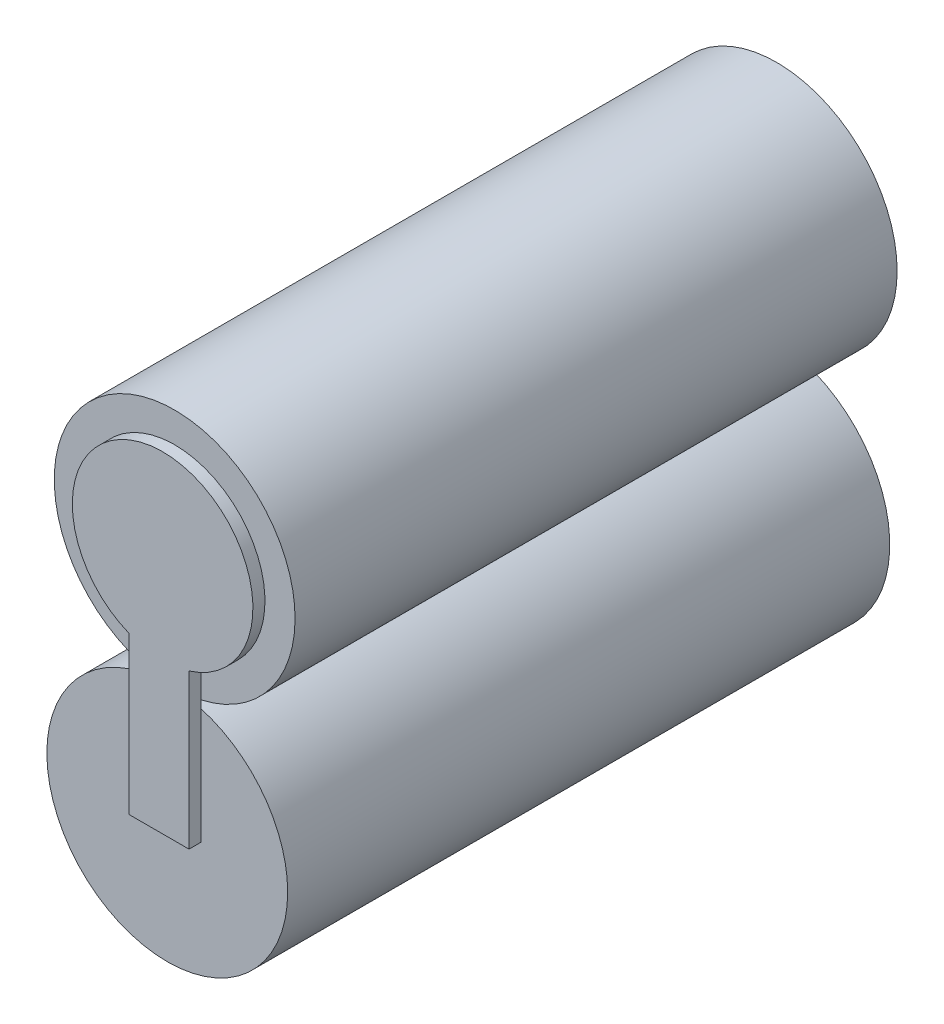
ISO-10303-21;
HEADER;
FILE_DESCRIPTION(('STEP AP214'),'2;1');
FILE_NAME('part.step','',(''),(''),'','','');
FILE_SCHEMA(('AUTOMOTIVE_DESIGN { 1 0 10303 214 1 1 1 1 }'));
ENDSEC;
DATA;
#1=APPLICATION_CONTEXT('core data for automotive mechanical design processes');
#2=APPLICATION_PROTOCOL_DEFINITION('international standard','automotive_design',2000,#1);
#3=PRODUCT_CONTEXT('',#1,'mechanical');
#4=PRODUCT('Part','Part','',(#3));
#5=PRODUCT_RELATED_PRODUCT_CATEGORY('part','',(#4));
#6=PRODUCT_DEFINITION_FORMATION('','',#4);
#7=PRODUCT_DEFINITION_CONTEXT('part definition',#1,'design');
#8=PRODUCT_DEFINITION('design','',#6,#7);
#9=PRODUCT_DEFINITION_SHAPE('','',#8);
#10=(LENGTH_UNIT() NAMED_UNIT(*) SI_UNIT(.MILLI.,.METRE.));
#11=(NAMED_UNIT(*) PLANE_ANGLE_UNIT() SI_UNIT($,.RADIAN.));
#12=(NAMED_UNIT(*) SI_UNIT($,.STERADIAN.) SOLID_ANGLE_UNIT());
#13=UNCERTAINTY_MEASURE_WITH_UNIT(LENGTH_MEASURE(1.E-05),#10,'distance_accuracy_value','');
#14=(GEOMETRIC_REPRESENTATION_CONTEXT(3) GLOBAL_UNCERTAINTY_ASSIGNED_CONTEXT((#13)) GLOBAL_UNIT_ASSIGNED_CONTEXT((#10,
#11,#12)) REPRESENTATION_CONTEXT('',''));
#15=CARTESIAN_POINT('',(0.,0.,0.));
#16=DIRECTION('',(0.,0.,1.));
#17=DIRECTION('',(1.,0.,0.));
#18=AXIS2_PLACEMENT_3D('',#15,#16,#17);
#19=CARTESIAN_POINT('',(-67.9226645266029,509.706213161394,50.));
#20=DIRECTION('',(0.,0.,-1.));
#21=DIRECTION('',(-1.,0.,0.));
#22=AXIS2_PLACEMENT_3D('',#19,#20,#21);
#23=CYLINDRICAL_SURFACE('',#22,10.0000000000001);
#24=CARTESIAN_POINT('',(-67.9226645266029,509.706213161394,50.));
#25=DIRECTION('',(0.,0.,1.));
#26=DIRECTION('',(1.,0.,0.));
#27=AXIS2_PLACEMENT_3D('',#24,#25,#26);
#28=CIRCLE('',#27,10.0000000000001);
#29=CARTESIAN_POINT('',(-57.9226645266028,509.706213161394,50.));
#30=VERTEX_POINT('',#29);
#31=EDGE_CURVE('E74',#30,#30,#28,.T.);
#32=ORIENTED_EDGE('',*,*,#31,.F.);
#33=EDGE_LOOP('',(#32));
#34=FACE_BOUND('',#33,.T.);
#35=CARTESIAN_POINT('',(-67.9226645266029,509.706213161394,0.));
#36=DIRECTION('',(0.,0.,1.));
#37=DIRECTION('',(1.,0.,0.));
#38=AXIS2_PLACEMENT_3D('',#35,#36,#37);
#39=CIRCLE('',#38,10.0000000000001);
#40=CARTESIAN_POINT('',(-65.1157716757957,519.304200060952,0.));
#41=VERTEX_POINT('',#40);
#42=CARTESIAN_POINT('',(-70.1157716757957,519.462763834257,0.));
#43=VERTEX_POINT('',#42);
#44=EDGE_CURVE('E69',#41,#43,#39,.T.);
#45=ORIENTED_EDGE('',*,*,#44,.T.);
#46=EDGE_CURVE('E87',#43,#41,#39,.T.);
#47=ORIENTED_EDGE('',*,*,#46,.T.);
#48=EDGE_LOOP('',(#45,#47));
#49=FACE_BOUND('',#48,.T.);
#50=ADVANCED_FACE('F66',(#34,#49),#23,.T.);
#51=CARTESIAN_POINT('',(0.,0.,50.));
#52=DIRECTION('',(0.,0.,1.));
#53=DIRECTION('',(1.,0.,0.));
#54=AXIS2_PLACEMENT_3D('',#51,#52,#53);
#55=PLANE('',#54);
#56=ORIENTED_EDGE('',*,*,#31,.T.);
#57=EDGE_LOOP('',(#56));
#58=FACE_BOUND('',#57,.T.);
#59=ADVANCED_FACE('F176',(#58),#55,.T.);
#60=CARTESIAN_POINT('',(0.,0.,0.));
#61=DIRECTION('',(0.,0.,1.));
#62=DIRECTION('',(1.,0.,0.));
#63=AXIS2_PLACEMENT_3D('',#60,#61,#62);
#64=PLANE('',#63);
#65=DIRECTION('',(0.,-1.,0.));
#66=VECTOR('',#65,1.);
#67=CARTESIAN_POINT('',(-65.1157716757957,516.661164816444,0.));
#68=LINE('',#67,#66);
#69=CARTESIAN_POINT('',(-65.1157716757957,516.661164816444,0.));
#70=VERTEX_POINT('',#69);
#71=EDGE_CURVE('E15',#41,#70,#68,.T.);
#72=ORIENTED_EDGE('',*,*,#71,.F.);
#73=ORIENTED_EDGE('',*,*,#46,.F.);
#74=DIRECTION('',(0.,1.,0.));
#75=VECTOR('',#74,1.);
#76=CARTESIAN_POINT('',(-70.1157716757957,516.878401184038,0.));
#77=LINE('',#76,#75);
#78=CARTESIAN_POINT('',(-70.1157716757957,516.878401184038,0.));
#79=VERTEX_POINT('',#78);
#80=EDGE_CURVE('E155',#79,#43,#77,.T.);
#81=ORIENTED_EDGE('',*,*,#80,.F.);
#82=CARTESIAN_POINT('',(-67.9226645266029,509.706213161394,0.));
#83=DIRECTION('',(0.,0.,-1.));
#84=DIRECTION('',(-1.,0.,0.));
#85=AXIS2_PLACEMENT_3D('',#82,#83,#84);
#86=CIRCLE('',#85,7.49999999999999);
#87=EDGE_CURVE('E83',#70,#79,#86,.T.);
#88=ORIENTED_EDGE('',*,*,#87,.F.);
#89=EDGE_LOOP('',(#72,#73,#81,#88));
#90=FACE_BOUND('',#89,.T.);
#91=ADVANCED_FACE('F181',(#90),#64,.F.);
#92=CARTESIAN_POINT('',(-65.1157716757957,516.661164816444,-1.));
#93=DIRECTION('',(-1.,0.,0.));
#94=DIRECTION('',(0.,0.,1.));
#95=AXIS2_PLACEMENT_3D('',#92,#93,#94);
#96=PLANE('',#95);
#97=CARTESIAN_POINT('',(-65.1157716757957,529.696502890967,0.));
#98=VERTEX_POINT('',#97);
#99=EDGE_CURVE('E76',#98,#41,#68,.T.);
#100=ORIENTED_EDGE('',*,*,#99,.T.);
#101=ORIENTED_EDGE('',*,*,#71,.T.);
#102=DIRECTION('',(0.,0.,1.));
#103=VECTOR('',#102,1.);
#104=CARTESIAN_POINT('',(-65.1157716757957,516.661164816444,-1.));
#105=LINE('',#104,#103);
#106=CARTESIAN_POINT('',(-65.1157716757957,516.661164816444,-1.));
#107=VERTEX_POINT('',#106);
#108=EDGE_CURVE('E117',#107,#70,#105,.T.);
#109=ORIENTED_EDGE('',*,*,#108,.F.);
#110=DIRECTION('',(0.,-1.,0.));
#111=VECTOR('',#110,1.);
#112=CARTESIAN_POINT('',(-65.1157716757957,516.661164816444,-1.));
#113=LINE('',#112,#111);
#114=CARTESIAN_POINT('',(-65.1157716757957,529.696502890967,-1.));
#115=VERTEX_POINT('',#114);
#116=EDGE_CURVE('E123',#115,#107,#113,.T.);
#117=ORIENTED_EDGE('',*,*,#116,.F.);
#118=DIRECTION('',(0.,0.,1.));
#119=VECTOR('',#118,1.);
#120=CARTESIAN_POINT('',(-65.1157716757957,529.696502890967,-1.));
#121=LINE('',#120,#119);
#122=EDGE_CURVE('E161',#115,#98,#121,.T.);
#123=ORIENTED_EDGE('',*,*,#122,.T.);
#124=EDGE_LOOP('',(#100,#101,#109,#117,#123));
#125=FACE_BOUND('',#124,.T.);
#126=ADVANCED_FACE('F135',(#125),#96,.F.);
#127=CARTESIAN_POINT('',(-67.9226645266029,509.706213161394,-1.));
#128=DIRECTION('',(0.,0.,1.));
#129=DIRECTION('',(1.,0.,0.));
#130=AXIS2_PLACEMENT_3D('',#127,#128,#129);
#131=CYLINDRICAL_SURFACE('',#130,7.49999999999999);
#132=ORIENTED_EDGE('',*,*,#87,.T.);
#133=DIRECTION('',(0.,0.,1.));
#134=VECTOR('',#133,1.);
#135=CARTESIAN_POINT('',(-70.1157716757957,516.878401184038,-1.));
#136=LINE('',#135,#134);
#137=CARTESIAN_POINT('',(-70.1157716757957,516.878401184038,-1.));
#138=VERTEX_POINT('',#137);
#139=EDGE_CURVE('E119',#138,#79,#136,.T.);
#140=ORIENTED_EDGE('',*,*,#139,.F.);
#141=CARTESIAN_POINT('',(-67.9226645266029,509.706213161394,-1.));
#142=DIRECTION('',(0.,0.,-1.));
#143=DIRECTION('',(-1.,0.,0.));
#144=AXIS2_PLACEMENT_3D('',#141,#142,#143);
#145=CIRCLE('',#144,7.49999999999999);
#146=EDGE_CURVE('E113',#107,#138,#145,.T.);
#147=ORIENTED_EDGE('',*,*,#146,.F.);
#148=ORIENTED_EDGE('',*,*,#108,.T.);
#149=EDGE_LOOP('',(#132,#140,#147,#148));
#150=FACE_BOUND('',#149,.T.);
#151=ADVANCED_FACE('F115',(#150),#131,.T.);
#152=CARTESIAN_POINT('',(-70.1157716757957,516.878401184038,-1.));
#153=DIRECTION('',(1.,0.,0.));
#154=DIRECTION('',(0.,0.,-1.));
#155=AXIS2_PLACEMENT_3D('',#152,#153,#154);
#156=PLANE('',#155);
#157=ORIENTED_EDGE('',*,*,#80,.T.);
#158=CARTESIAN_POINT('',(-70.1157716757957,529.696502890967,0.));
#159=VERTEX_POINT('',#158);
#160=EDGE_CURVE('E149',#43,#159,#77,.T.);
#161=ORIENTED_EDGE('',*,*,#160,.T.);
#162=DIRECTION('',(0.,0.,1.));
#163=VECTOR('',#162,1.);
#164=CARTESIAN_POINT('',(-70.1157716757957,529.696502890967,-1.));
#165=LINE('',#164,#163);
#166=CARTESIAN_POINT('',(-70.1157716757957,529.696502890967,-1.));
#167=VERTEX_POINT('',#166);
#168=EDGE_CURVE('E137',#167,#159,#165,.T.);
#169=ORIENTED_EDGE('',*,*,#168,.F.);
#170=DIRECTION('',(0.,1.,0.));
#171=VECTOR('',#170,1.);
#172=CARTESIAN_POINT('',(-70.1157716757957,516.878401184038,-1.));
#173=LINE('',#172,#171);
#174=EDGE_CURVE('E122',#138,#167,#173,.T.);
#175=ORIENTED_EDGE('',*,*,#174,.F.);
#176=ORIENTED_EDGE('',*,*,#139,.T.);
#177=EDGE_LOOP('',(#157,#161,#169,#175,#176));
#178=FACE_BOUND('',#177,.T.);
#179=ADVANCED_FACE('F157',(#178),#156,.F.);
#180=CARTESIAN_POINT('',(-70.1157716757957,529.696502890967,-1.));
#181=DIRECTION('',(0.,-1.,0.));
#182=DIRECTION('',(0.,0.,-1.));
#183=AXIS2_PLACEMENT_3D('',#180,#181,#182);
#184=PLANE('',#183);
#185=DIRECTION('',(1.,0.,0.));
#186=VECTOR('',#185,1.);
#187=CARTESIAN_POINT('',(-70.1157716757957,529.696502890967,0.));
#188=LINE('',#187,#186);
#189=EDGE_CURVE('E132',#159,#98,#188,.T.);
#190=ORIENTED_EDGE('',*,*,#189,.T.);
#191=ORIENTED_EDGE('',*,*,#122,.F.);
#192=DIRECTION('',(1.,0.,0.));
#193=VECTOR('',#192,1.);
#194=CARTESIAN_POINT('',(-70.1157716757957,529.696502890967,-1.));
#195=LINE('',#194,#193);
#196=EDGE_CURVE('E128',#167,#115,#195,.T.);
#197=ORIENTED_EDGE('',*,*,#196,.F.);
#198=ORIENTED_EDGE('',*,*,#168,.T.);
#199=EDGE_LOOP('',(#190,#191,#197,#198));
#200=FACE_BOUND('',#199,.T.);
#201=ADVANCED_FACE('F163',(#200),#184,.F.);
#202=CARTESIAN_POINT('',(-67.9226645266029,509.706213161394,-1.));
#203=DIRECTION('',(0.,0.,-1.));
#204=DIRECTION('',(-1.,0.,0.));
#205=AXIS2_PLACEMENT_3D('',#202,#203,#204);
#206=PLANE('',#205);
#207=ORIENTED_EDGE('',*,*,#116,.T.);
#208=ORIENTED_EDGE('',*,*,#146,.T.);
#209=ORIENTED_EDGE('',*,*,#174,.T.);
#210=ORIENTED_EDGE('',*,*,#196,.T.);
#211=EDGE_LOOP('',(#207,#208,#209,#210));
#212=FACE_BOUND('',#211,.T.);
#213=ADVANCED_FACE('F126',(#212),#206,.T.);
#214=CARTESIAN_POINT('',(-67.9226645266029,509.706213161394,0.));
#215=DIRECTION('',(0.,0.,-1.));
#216=DIRECTION('',(-1.,0.,0.));
#217=AXIS2_PLACEMENT_3D('',#214,#215,#216);
#218=PLANE('',#217);
#219=ORIENTED_EDGE('',*,*,#44,.F.);
#220=ORIENTED_EDGE('',*,*,#99,.F.);
#221=ORIENTED_EDGE('',*,*,#189,.F.);
#222=ORIENTED_EDGE('',*,*,#160,.F.);
#223=EDGE_LOOP('',(#219,#220,#221,#222));
#224=FACE_BOUND('',#223,.T.);
#225=ADVANCED_FACE('F151',(#224),#218,.F.);
#226=CLOSED_SHELL('',(#50,#59,#91,#126,#151,#179,#201,#213,#225));
#227=MANIFOLD_SOLID_BREP('B2',#226);
#228=CARTESIAN_POINT('',(-67.3088788249885,529.696792620541,50.));
#229=DIRECTION('',(0.,0.,-1.));
#230=DIRECTION('',(-1.,0.,0.));
#231=AXIS2_PLACEMENT_3D('',#228,#229,#230);
#232=CYLINDRICAL_SURFACE('',#231,9.99999999999996);
#233=CARTESIAN_POINT('',(-67.3088788249885,529.696792620541,50.));
#234=DIRECTION('',(0.,0.,1.));
#235=DIRECTION('',(1.,0.,0.));
#236=AXIS2_PLACEMENT_3D('',#233,#234,#235);
#237=CIRCLE('',#236,9.99999999999996);
#238=CARTESIAN_POINT('',(-70.1157716757957,520.098805720983,50.));
#239=VERTEX_POINT('',#238);
#240=CARTESIAN_POINT('',(-65.1157716757957,519.940241947677,50.));
#241=VERTEX_POINT('',#240);
#242=EDGE_CURVE('E257',#239,#241,#237,.T.);
#243=ORIENTED_EDGE('',*,*,#242,.F.);
#244=EDGE_CURVE('E322',#241,#239,#237,.T.);
#245=ORIENTED_EDGE('',*,*,#244,.F.);
#246=EDGE_LOOP('',(#243,#245));
#247=FACE_BOUND('',#246,.T.);
#248=CARTESIAN_POINT('',(-67.3088788249885,529.696792620541,0.));
#249=DIRECTION('',(0.,0.,1.));
#250=DIRECTION('',(1.,0.,0.));
#251=AXIS2_PLACEMENT_3D('',#248,#249,#250);
#252=CIRCLE('',#251,9.99999999999996);
#253=CARTESIAN_POINT('',(-57.3088788249885,529.696792620541,0.));
#254=VERTEX_POINT('',#253);
#255=EDGE_CURVE('E252',#254,#254,#252,.T.);
#256=ORIENTED_EDGE('',*,*,#255,.T.);
#257=EDGE_LOOP('',(#256));
#258=FACE_BOUND('',#257,.T.);
#259=ADVANCED_FACE('F249',(#247,#258),#232,.T.);
#260=CARTESIAN_POINT('',(0.,0.,50.));
#261=DIRECTION('',(0.,0.,1.));
#262=DIRECTION('',(1.,0.,0.));
#263=AXIS2_PLACEMENT_3D('',#260,#261,#262);
#264=PLANE('',#263);
#265=DIRECTION('',(0.,-1.,0.));
#266=VECTOR('',#265,1.);
#267=CARTESIAN_POINT('',(-70.1157716757957,522.741840965491,50.));
#268=LINE('',#267,#266);
#269=CARTESIAN_POINT('',(-70.1157716757957,522.741840965491,50.));
#270=VERTEX_POINT('',#269);
#271=EDGE_CURVE('E266',#270,#239,#268,.T.);
#272=ORIENTED_EDGE('',*,*,#271,.F.);
#273=CARTESIAN_POINT('',(-67.3088788249885,529.696792620541,50.));
#274=DIRECTION('',(0.,0.,1.));
#275=DIRECTION('',(1.,0.,0.));
#276=AXIS2_PLACEMENT_3D('',#273,#274,#275);
#277=CIRCLE('',#276,7.49999999999999);
#278=CARTESIAN_POINT('',(-65.1157716757957,522.524604597897,50.));
#279=VERTEX_POINT('',#278);
#280=EDGE_CURVE('E314',#279,#270,#277,.T.);
#281=ORIENTED_EDGE('',*,*,#280,.F.);
#282=DIRECTION('',(0.,1.,0.));
#283=VECTOR('',#282,1.);
#284=CARTESIAN_POINT('',(-65.1157716757957,522.524604597897,50.));
#285=LINE('',#284,#283);
#286=EDGE_CURVE('E64',#241,#279,#285,.T.);
#287=ORIENTED_EDGE('',*,*,#286,.F.);
#288=ORIENTED_EDGE('',*,*,#244,.T.);
#289=EDGE_LOOP('',(#272,#281,#287,#288));
#290=FACE_BOUND('',#289,.T.);
#291=ADVANCED_FACE('F331',(#290),#264,.T.);
#292=CARTESIAN_POINT('',(0.,0.,0.));
#293=DIRECTION('',(0.,0.,1.));
#294=DIRECTION('',(1.,0.,0.));
#295=AXIS2_PLACEMENT_3D('',#292,#293,#294);
#296=PLANE('',#295);
#297=ORIENTED_EDGE('',*,*,#255,.F.);
#298=EDGE_LOOP('',(#297));
#299=FACE_BOUND('',#298,.T.);
#300=ADVANCED_FACE('F361',(#299),#296,.F.);
#301=CARTESIAN_POINT('',(-67.3088788249885,529.696792620541,50.));
#302=DIRECTION('',(0.,0.,1.));
#303=DIRECTION('',(1.,0.,0.));
#304=AXIS2_PLACEMENT_3D('',#301,#302,#303);
#305=PLANE('',#304);
#306=CARTESIAN_POINT('',(-70.1157716757957,509.706502890967,50.));
#307=VERTEX_POINT('',#306);
#308=EDGE_CURVE('E318',#239,#307,#268,.T.);
#309=ORIENTED_EDGE('',*,*,#308,.F.);
#310=ORIENTED_EDGE('',*,*,#242,.T.);
#311=CARTESIAN_POINT('',(-65.1157716757957,509.706502890967,50.));
#312=VERTEX_POINT('',#311);
#313=EDGE_CURVE('E259',#312,#241,#285,.T.);
#314=ORIENTED_EDGE('',*,*,#313,.F.);
#315=DIRECTION('',(1.,0.,0.));
#316=VECTOR('',#315,1.);
#317=CARTESIAN_POINT('',(-65.1157716757957,509.706502890967,50.));
#318=LINE('',#317,#316);
#319=EDGE_CURVE('E335',#307,#312,#318,.T.);
#320=ORIENTED_EDGE('',*,*,#319,.F.);
#321=EDGE_LOOP('',(#309,#310,#314,#320));
#322=FACE_BOUND('',#321,.T.);
#323=ADVANCED_FACE('F334',(#322),#305,.F.);
#324=CARTESIAN_POINT('',(-70.1157716757957,522.741840965491,51.));
#325=DIRECTION('',(1.,0.,0.));
#326=DIRECTION('',(0.,0.,-1.));
#327=AXIS2_PLACEMENT_3D('',#324,#325,#326);
#328=PLANE('',#327);
#329=ORIENTED_EDGE('',*,*,#271,.T.);
#330=ORIENTED_EDGE('',*,*,#308,.T.);
#331=DIRECTION('',(0.,0.,-1.));
#332=VECTOR('',#331,1.);
#333=CARTESIAN_POINT('',(-70.1157716757957,509.706502890967,51.));
#334=LINE('',#333,#332);
#335=CARTESIAN_POINT('',(-70.1157716757957,509.706502890967,51.));
#336=VERTEX_POINT('',#335);
#337=EDGE_CURVE('E299',#336,#307,#334,.T.);
#338=ORIENTED_EDGE('',*,*,#337,.F.);
#339=DIRECTION('',(0.,-1.,0.));
#340=VECTOR('',#339,1.);
#341=CARTESIAN_POINT('',(-70.1157716757957,522.741840965491,51.));
#342=LINE('',#341,#340);
#343=CARTESIAN_POINT('',(-70.1157716757957,522.741840965491,51.));
#344=VERTEX_POINT('',#343);
#345=EDGE_CURVE('E305',#344,#336,#342,.T.);
#346=ORIENTED_EDGE('',*,*,#345,.F.);
#347=DIRECTION('',(0.,0.,-1.));
#348=VECTOR('',#347,1.);
#349=CARTESIAN_POINT('',(-70.1157716757957,522.741840965491,51.));
#350=LINE('',#349,#348);
#351=EDGE_CURVE('E337',#344,#270,#350,.T.);
#352=ORIENTED_EDGE('',*,*,#351,.T.);
#353=EDGE_LOOP('',(#329,#330,#338,#346,#352));
#354=FACE_BOUND('',#353,.T.);
#355=ADVANCED_FACE('F316',(#354),#328,.F.);
#356=CARTESIAN_POINT('',(-65.1157716757957,509.706502890967,51.));
#357=DIRECTION('',(0.,1.,0.));
#358=DIRECTION('',(0.,0.,1.));
#359=AXIS2_PLACEMENT_3D('',#356,#357,#358);
#360=PLANE('',#359);
#361=ORIENTED_EDGE('',*,*,#319,.T.);
#362=DIRECTION('',(0.,0.,-1.));
#363=VECTOR('',#362,1.);
#364=CARTESIAN_POINT('',(-65.1157716757957,509.706502890967,51.));
#365=LINE('',#364,#363);
#366=CARTESIAN_POINT('',(-65.1157716757957,509.706502890967,51.));
#367=VERTEX_POINT('',#366);
#368=EDGE_CURVE('E301',#367,#312,#365,.T.);
#369=ORIENTED_EDGE('',*,*,#368,.F.);
#370=DIRECTION('',(1.,0.,0.));
#371=VECTOR('',#370,1.);
#372=CARTESIAN_POINT('',(-65.1157716757957,509.706502890967,51.));
#373=LINE('',#372,#371);
#374=EDGE_CURVE('E295',#336,#367,#373,.T.);
#375=ORIENTED_EDGE('',*,*,#374,.F.);
#376=ORIENTED_EDGE('',*,*,#337,.T.);
#377=EDGE_LOOP('',(#361,#369,#375,#376));
#378=FACE_BOUND('',#377,.T.);
#379=ADVANCED_FACE('F297',(#378),#360,.F.);
#380=CARTESIAN_POINT('',(-65.1157716757957,522.524604597897,51.));
#381=DIRECTION('',(-1.,0.,0.));
#382=DIRECTION('',(0.,0.,1.));
#383=AXIS2_PLACEMENT_3D('',#380,#381,#382);
#384=PLANE('',#383);
#385=ORIENTED_EDGE('',*,*,#313,.T.);
#386=ORIENTED_EDGE('',*,*,#286,.T.);
#387=DIRECTION('',(0.,0.,-1.));
#388=VECTOR('',#387,1.);
#389=CARTESIAN_POINT('',(-65.1157716757957,522.524604597897,51.));
#390=LINE('',#389,#388);
#391=CARTESIAN_POINT('',(-65.1157716757957,522.524604597897,51.));
#392=VERTEX_POINT('',#391);
#393=EDGE_CURVE('E323',#392,#279,#390,.T.);
#394=ORIENTED_EDGE('',*,*,#393,.F.);
#395=DIRECTION('',(0.,1.,0.));
#396=VECTOR('',#395,1.);
#397=CARTESIAN_POINT('',(-65.1157716757957,522.524604597897,51.));
#398=LINE('',#397,#396);
#399=EDGE_CURVE('E304',#367,#392,#398,.T.);
#400=ORIENTED_EDGE('',*,*,#399,.F.);
#401=ORIENTED_EDGE('',*,*,#368,.T.);
#402=EDGE_LOOP('',(#385,#386,#394,#400,#401));
#403=FACE_BOUND('',#402,.T.);
#404=ADVANCED_FACE('F348',(#403),#384,.F.);
#405=CARTESIAN_POINT('',(-67.3088788249885,529.696792620541,51.));
#406=DIRECTION('',(0.,0.,-1.));
#407=DIRECTION('',(-1.,0.,0.));
#408=AXIS2_PLACEMENT_3D('',#405,#406,#407);
#409=CYLINDRICAL_SURFACE('',#408,7.49999999999999);
#410=ORIENTED_EDGE('',*,*,#280,.T.);
#411=ORIENTED_EDGE('',*,*,#351,.F.);
#412=CARTESIAN_POINT('',(-67.3088788249885,529.696792620541,51.));
#413=DIRECTION('',(0.,0.,1.));
#414=DIRECTION('',(1.,0.,0.));
#415=AXIS2_PLACEMENT_3D('',#412,#413,#414);
#416=CIRCLE('',#415,7.49999999999999);
#417=EDGE_CURVE('E310',#392,#344,#416,.T.);
#418=ORIENTED_EDGE('',*,*,#417,.F.);
#419=ORIENTED_EDGE('',*,*,#393,.T.);
#420=EDGE_LOOP('',(#410,#411,#418,#419));
#421=FACE_BOUND('',#420,.T.);
#422=ADVANCED_FACE('F346',(#421),#409,.T.);
#423=CARTESIAN_POINT('',(-67.3088788249885,529.696792620541,51.));
#424=DIRECTION('',(0.,0.,1.));
#425=DIRECTION('',(1.,0.,0.));
#426=AXIS2_PLACEMENT_3D('',#423,#424,#425);
#427=PLANE('',#426);
#428=ORIENTED_EDGE('',*,*,#345,.T.);
#429=ORIENTED_EDGE('',*,*,#374,.T.);
#430=ORIENTED_EDGE('',*,*,#399,.T.);
#431=ORIENTED_EDGE('',*,*,#417,.T.);
#432=EDGE_LOOP('',(#428,#429,#430,#431));
#433=FACE_BOUND('',#432,.T.);
#434=ADVANCED_FACE('F308',(#433),#427,.T.);
#435=CLOSED_SHELL('',(#259,#291,#300,#323,#355,#379,#404,#422,#434));
#436=MANIFOLD_SOLID_BREP('B9',#435);
#437=ADVANCED_BREP_SHAPE_REPRESENTATION('',(#18,#227,#436),#14);
#438=SHAPE_DEFINITION_REPRESENTATION(#9,#437);
ENDSEC;
END-ISO-10303-21;
